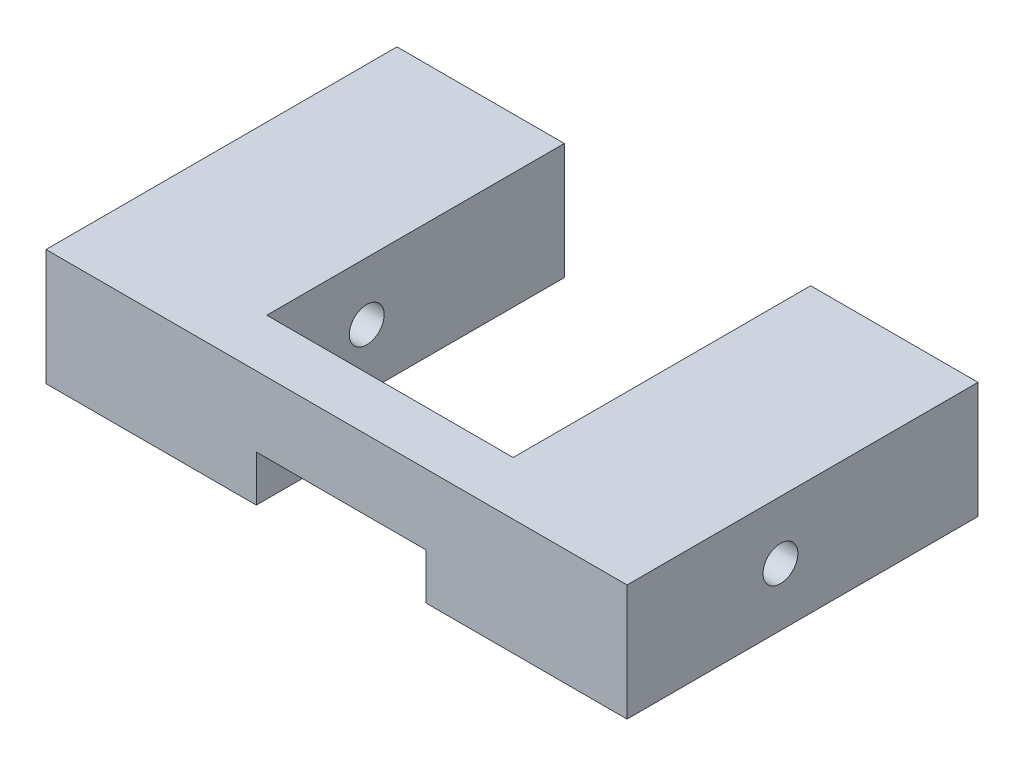
ISO-10303-21;
HEADER;
FILE_DESCRIPTION(('STEP AP214'),'2;1');
FILE_NAME('part.step','',(''),(''),'','','');
FILE_SCHEMA(('AUTOMOTIVE_DESIGN { 1 0 10303 214 1 1 1 1 }'));
ENDSEC;
DATA;
#1=APPLICATION_CONTEXT('core data for automotive mechanical design processes');
#2=APPLICATION_PROTOCOL_DEFINITION('international standard','automotive_design',2000,#1);
#3=PRODUCT_CONTEXT('',#1,'mechanical');
#4=PRODUCT('Part','Part','',(#3));
#5=PRODUCT_RELATED_PRODUCT_CATEGORY('part','',(#4));
#6=PRODUCT_DEFINITION_FORMATION('','',#4);
#7=PRODUCT_DEFINITION_CONTEXT('part definition',#1,'design');
#8=PRODUCT_DEFINITION('design','',#6,#7);
#9=PRODUCT_DEFINITION_SHAPE('','',#8);
#10=(LENGTH_UNIT() NAMED_UNIT(*) SI_UNIT(.MILLI.,.METRE.));
#11=(NAMED_UNIT(*) PLANE_ANGLE_UNIT() SI_UNIT($,.RADIAN.));
#12=(NAMED_UNIT(*) SI_UNIT($,.STERADIAN.) SOLID_ANGLE_UNIT());
#13=UNCERTAINTY_MEASURE_WITH_UNIT(LENGTH_MEASURE(1.E-05),#10,'distance_accuracy_value','');
#14=(GEOMETRIC_REPRESENTATION_CONTEXT(3) GLOBAL_UNCERTAINTY_ASSIGNED_CONTEXT((#13)) GLOBAL_UNIT_ASSIGNED_CONTEXT((#10,
#11,#12)) REPRESENTATION_CONTEXT('',''));
#15=CARTESIAN_POINT('',(0.,0.,0.));
#16=DIRECTION('',(0.,0.,1.));
#17=DIRECTION('',(1.,0.,0.));
#18=AXIS2_PLACEMENT_3D('',#15,#16,#17);
#19=CARTESIAN_POINT('',(0.,0.,0.));
#20=DIRECTION('',(0.,1.,0.));
#21=DIRECTION('',(0.,0.,1.));
#22=AXIS2_PLACEMENT_3D('',#19,#20,#21);
#23=PLANE('',#22);
#24=DIRECTION('',(1.,0.,0.));
#25=VECTOR('',#24,1.);
#26=CARTESIAN_POINT('',(-12.5,0.,4.8));
#27=LINE('',#26,#25);
#28=CARTESIAN_POINT('',(3.84999999999999,0.,4.8));
#29=VERTEX_POINT('',#28);
#30=CARTESIAN_POINT('',(12.5,0.,4.8));
#31=VERTEX_POINT('',#30);
#32=EDGE_CURVE('E241',#29,#31,#27,.T.);
#33=ORIENTED_EDGE('',*,*,#32,.F.);
#34=DIRECTION('',(0.,0.,-1.));
#35=VECTOR('',#34,1.);
#36=CARTESIAN_POINT('',(3.84999999999999,0.,12.5));
#37=LINE('',#36,#35);
#38=CARTESIAN_POINT('',(3.84999999999999,0.,2.5));
#39=VERTEX_POINT('',#38);
#40=EDGE_CURVE('E210',#29,#39,#37,.T.);
#41=ORIENTED_EDGE('',*,*,#40,.T.);
#42=DIRECTION('',(1.,0.,0.));
#43=VECTOR('',#42,1.);
#44=CARTESIAN_POINT('',(0.,0.,2.5));
#45=LINE('',#44,#43);
#46=CARTESIAN_POINT('',(5.3,0.,2.5));
#47=VERTEX_POINT('',#46);
#48=EDGE_CURVE('E70',#39,#47,#45,.T.);
#49=ORIENTED_EDGE('',*,*,#48,.T.);
#50=DIRECTION('',(0.,0.,-1.));
#51=VECTOR('',#50,1.);
#52=CARTESIAN_POINT('',(5.3,0.,0.));
#53=LINE('',#52,#51);
#54=CARTESIAN_POINT('',(5.3,0.,-10.3));
#55=VERTEX_POINT('',#54);
#56=EDGE_CURVE('E55',#47,#55,#53,.T.);
#57=ORIENTED_EDGE('',*,*,#56,.T.);
#58=DIRECTION('',(-1.,0.,0.));
#59=VECTOR('',#58,1.);
#60=CARTESIAN_POINT('',(12.5,0.,-10.3));
#61=LINE('',#60,#59);
#62=CARTESIAN_POINT('',(12.5,0.,-10.3));
#63=VERTEX_POINT('',#62);
#64=EDGE_CURVE('E172',#63,#55,#61,.T.);
#65=ORIENTED_EDGE('',*,*,#64,.F.);
#66=DIRECTION('',(0.,0.,-1.));
#67=VECTOR('',#66,1.);
#68=CARTESIAN_POINT('',(12.5,0.,4.8));
#69=LINE('',#68,#67);
#70=EDGE_CURVE('E260',#31,#63,#69,.T.);
#71=ORIENTED_EDGE('',*,*,#70,.F.);
#72=EDGE_LOOP('',(#33,#41,#49,#57,#65,#71));
#73=FACE_BOUND('',#72,.T.);
#74=ADVANCED_FACE('F45',(#73),#23,.F.);
#75=CARTESIAN_POINT('',(-12.5,5.,4.8));
#76=DIRECTION('',(0.,0.,-1.));
#77=DIRECTION('',(-1.,0.,0.));
#78=AXIS2_PLACEMENT_3D('',#75,#76,#77);
#79=PLANE('',#78);
#80=DIRECTION('',(1.,0.,0.));
#81=VECTOR('',#80,1.);
#82=CARTESIAN_POINT('',(-12.5,1.98,4.8));
#83=LINE('',#82,#81);
#84=CARTESIAN_POINT('',(-3.45,1.98,4.8));
#85=VERTEX_POINT('',#84);
#86=CARTESIAN_POINT('',(3.85,1.98,4.8));
#87=VERTEX_POINT('',#86);
#88=EDGE_CURVE('E225',#85,#87,#83,.T.);
#89=ORIENTED_EDGE('',*,*,#88,.T.);
#90=DIRECTION('',(0.,-1.,0.));
#91=VECTOR('',#90,1.);
#92=CARTESIAN_POINT('',(3.85,4.99999999999999,4.8));
#93=LINE('',#92,#91);
#94=EDGE_CURVE('E151',#87,#29,#93,.T.);
#95=ORIENTED_EDGE('',*,*,#94,.T.);
#96=ORIENTED_EDGE('',*,*,#32,.T.);
#97=DIRECTION('',(0.,-1.,0.));
#98=VECTOR('',#97,1.);
#99=CARTESIAN_POINT('',(12.5,5.,4.8));
#100=LINE('',#99,#98);
#101=CARTESIAN_POINT('',(12.5,5.,4.8));
#102=VERTEX_POINT('',#101);
#103=EDGE_CURVE('E267',#102,#31,#100,.T.);
#104=ORIENTED_EDGE('',*,*,#103,.F.);
#105=DIRECTION('',(1.,0.,0.));
#106=VECTOR('',#105,1.);
#107=CARTESIAN_POINT('',(-12.5,5.,4.8));
#108=LINE('',#107,#106);
#109=CARTESIAN_POINT('',(-12.5,5.,4.8));
#110=VERTEX_POINT('',#109);
#111=EDGE_CURVE('E244',#110,#102,#108,.T.);
#112=ORIENTED_EDGE('',*,*,#111,.F.);
#113=DIRECTION('',(0.,-1.,0.));
#114=VECTOR('',#113,1.);
#115=CARTESIAN_POINT('',(-12.5,5.,4.8));
#116=LINE('',#115,#114);
#117=CARTESIAN_POINT('',(-12.5,0.,4.8));
#118=VERTEX_POINT('',#117);
#119=EDGE_CURVE('E255',#110,#118,#116,.T.);
#120=ORIENTED_EDGE('',*,*,#119,.T.);
#121=CARTESIAN_POINT('',(-3.45000000000001,0.,4.8));
#122=VERTEX_POINT('',#121);
#123=EDGE_CURVE('E256',#118,#122,#27,.T.);
#124=ORIENTED_EDGE('',*,*,#123,.T.);
#125=DIRECTION('',(0.,1.,0.));
#126=VECTOR('',#125,1.);
#127=CARTESIAN_POINT('',(-3.45,5.,4.8));
#128=LINE('',#127,#126);
#129=EDGE_CURVE('E214',#122,#85,#128,.T.);
#130=ORIENTED_EDGE('',*,*,#129,.T.);
#131=EDGE_LOOP('',(#89,#95,#96,#104,#112,#120,#124,#130));
#132=FACE_BOUND('',#131,.T.);
#133=ADVANCED_FACE('F47',(#132),#79,.F.);
#134=CARTESIAN_POINT('',(12.5,5.,4.8));
#135=DIRECTION('',(-1.,0.,0.));
#136=DIRECTION('',(0.,0.,1.));
#137=AXIS2_PLACEMENT_3D('',#134,#135,#136);
#138=PLANE('',#137);
#139=CARTESIAN_POINT('',(12.5,2.5,-1.8));
#140=DIRECTION('',(-1.,0.,0.));
#141=DIRECTION('',(0.,0.,1.));
#142=AXIS2_PLACEMENT_3D('',#139,#140,#141);
#143=CIRCLE('',#142,0.75);
#144=CARTESIAN_POINT('',(12.5,2.5,-1.05));
#145=VERTEX_POINT('',#144);
#146=EDGE_CURVE('E196',#145,#145,#143,.T.);
#147=ORIENTED_EDGE('',*,*,#146,.T.);
#148=EDGE_LOOP('',(#147));
#149=FACE_BOUND('',#148,.T.);
#150=ORIENTED_EDGE('',*,*,#70,.T.);
#151=DIRECTION('',(0.,-1.,0.));
#152=VECTOR('',#151,1.);
#153=CARTESIAN_POINT('',(12.5,5.,-10.3));
#154=LINE('',#153,#152);
#155=CARTESIAN_POINT('',(12.5,5.,-10.3));
#156=VERTEX_POINT('',#155);
#157=EDGE_CURVE('E166',#156,#63,#154,.T.);
#158=ORIENTED_EDGE('',*,*,#157,.F.);
#159=DIRECTION('',(0.,0.,-1.));
#160=VECTOR('',#159,1.);
#161=CARTESIAN_POINT('',(12.5,5.,4.8));
#162=LINE('',#161,#160);
#163=EDGE_CURVE('E248',#102,#156,#162,.T.);
#164=ORIENTED_EDGE('',*,*,#163,.F.);
#165=ORIENTED_EDGE('',*,*,#103,.T.);
#166=EDGE_LOOP('',(#150,#158,#164,#165));
#167=FACE_BOUND('',#166,.T.);
#168=ADVANCED_FACE('F288',(#149,#167),#138,.F.);
#169=CARTESIAN_POINT('',(-12.5,5.,4.8));
#170=DIRECTION('',(-1.,0.,0.));
#171=DIRECTION('',(0.,0.,1.));
#172=AXIS2_PLACEMENT_3D('',#169,#170,#171);
#173=PLANE('',#172);
#174=CARTESIAN_POINT('',(-12.5,2.5,-1.8));
#175=DIRECTION('',(-1.,0.,0.));
#176=DIRECTION('',(0.,0.,1.));
#177=AXIS2_PLACEMENT_3D('',#174,#175,#176);
#178=CIRCLE('',#177,0.75);
#179=CARTESIAN_POINT('',(-12.5,2.5,-1.05));
#180=VERTEX_POINT('',#179);
#181=EDGE_CURVE('E188',#180,#180,#178,.T.);
#182=ORIENTED_EDGE('',*,*,#181,.F.);
#183=EDGE_LOOP('',(#182));
#184=FACE_BOUND('',#183,.T.);
#185=DIRECTION('',(0.,0.,-1.));
#186=VECTOR('',#185,1.);
#187=CARTESIAN_POINT('',(-12.5,0.,4.8));
#188=LINE('',#187,#186);
#189=CARTESIAN_POINT('',(-12.5,0.,-10.3));
#190=VERTEX_POINT('',#189);
#191=EDGE_CURVE('E249',#118,#190,#188,.T.);
#192=ORIENTED_EDGE('',*,*,#191,.F.);
#193=ORIENTED_EDGE('',*,*,#119,.F.);
#194=DIRECTION('',(0.,0.,-1.));
#195=VECTOR('',#194,1.);
#196=CARTESIAN_POINT('',(-12.5,5.,4.8));
#197=LINE('',#196,#195);
#198=CARTESIAN_POINT('',(-12.5,5.,-10.3));
#199=VERTEX_POINT('',#198);
#200=EDGE_CURVE('E252',#110,#199,#197,.T.);
#201=ORIENTED_EDGE('',*,*,#200,.T.);
#202=DIRECTION('',(0.,1.,0.));
#203=VECTOR('',#202,1.);
#204=CARTESIAN_POINT('',(-12.5,5.,-10.3));
#205=LINE('',#204,#203);
#206=EDGE_CURVE('E160',#190,#199,#205,.T.);
#207=ORIENTED_EDGE('',*,*,#206,.F.);
#208=EDGE_LOOP('',(#192,#193,#201,#207));
#209=FACE_BOUND('',#208,.T.);
#210=ADVANCED_FACE('F306',(#184,#209),#173,.T.);
#211=CARTESIAN_POINT('',(0.,5.,0.));
#212=DIRECTION('',(0.,1.,0.));
#213=DIRECTION('',(0.,0.,1.));
#214=AXIS2_PLACEMENT_3D('',#211,#212,#213);
#215=PLANE('',#214);
#216=DIRECTION('',(0.,0.,1.));
#217=VECTOR('',#216,1.);
#218=CARTESIAN_POINT('',(-5.3,5.,-4.8));
#219=LINE('',#218,#217);
#220=CARTESIAN_POINT('',(-5.3,5.,-10.3));
#221=VERTEX_POINT('',#220);
#222=CARTESIAN_POINT('',(-5.3,5.,2.5));
#223=VERTEX_POINT('',#222);
#224=EDGE_CURVE('E139',#221,#223,#219,.T.);
#225=ORIENTED_EDGE('',*,*,#224,.F.);
#226=DIRECTION('',(1.,0.,0.));
#227=VECTOR('',#226,1.);
#228=CARTESIAN_POINT('',(-5.3,5.,-10.3));
#229=LINE('',#228,#227);
#230=EDGE_CURVE('E143',#199,#221,#229,.T.);
#231=ORIENTED_EDGE('',*,*,#230,.F.);
#232=ORIENTED_EDGE('',*,*,#200,.F.);
#233=ORIENTED_EDGE('',*,*,#111,.T.);
#234=ORIENTED_EDGE('',*,*,#163,.T.);
#235=DIRECTION('',(1.,0.,0.));
#236=VECTOR('',#235,1.);
#237=CARTESIAN_POINT('',(12.5,5.,-10.3));
#238=LINE('',#237,#236);
#239=CARTESIAN_POINT('',(5.3,5.,-10.3));
#240=VERTEX_POINT('',#239);
#241=EDGE_CURVE('E184',#240,#156,#238,.T.);
#242=ORIENTED_EDGE('',*,*,#241,.F.);
#243=DIRECTION('',(0.,0.,-1.));
#244=VECTOR('',#243,1.);
#245=CARTESIAN_POINT('',(5.3,5.,-4.8));
#246=LINE('',#245,#244);
#247=CARTESIAN_POINT('',(5.3,5.,2.5));
#248=VERTEX_POINT('',#247);
#249=EDGE_CURVE('E234',#248,#240,#246,.T.);
#250=ORIENTED_EDGE('',*,*,#249,.F.);
#251=DIRECTION('',(1.,0.,0.));
#252=VECTOR('',#251,1.);
#253=CARTESIAN_POINT('',(-5.3,5.,2.5));
#254=LINE('',#253,#252);
#255=EDGE_CURVE('E146',#223,#248,#254,.T.);
#256=ORIENTED_EDGE('',*,*,#255,.F.);
#257=EDGE_LOOP('',(#225,#231,#232,#233,#234,#242,#250,#256));
#258=FACE_BOUND('',#257,.T.);
#259=ADVANCED_FACE('F141',(#258),#215,.T.);
#260=CARTESIAN_POINT('',(-5.3,0.,2.5));
#261=VERTEX_POINT('',#260);
#262=CARTESIAN_POINT('',(-3.45000000000001,0.,2.5));
#263=VERTEX_POINT('',#262);
#264=EDGE_CURVE('E271',#261,#263,#45,.T.);
#265=ORIENTED_EDGE('',*,*,#264,.T.);
#266=DIRECTION('',(0.,0.,-1.));
#267=VECTOR('',#266,1.);
#268=CARTESIAN_POINT('',(-3.45000000000001,0.,12.5));
#269=LINE('',#268,#267);
#270=EDGE_CURVE('E62',#122,#263,#269,.T.);
#271=ORIENTED_EDGE('',*,*,#270,.F.);
#272=ORIENTED_EDGE('',*,*,#123,.F.);
#273=ORIENTED_EDGE('',*,*,#191,.T.);
#274=DIRECTION('',(-1.,0.,0.));
#275=VECTOR('',#274,1.);
#276=CARTESIAN_POINT('',(-5.3,0.,-10.3));
#277=LINE('',#276,#275);
#278=CARTESIAN_POINT('',(-5.3,0.,-10.3));
#279=VERTEX_POINT('',#278);
#280=EDGE_CURVE('E167',#279,#190,#277,.T.);
#281=ORIENTED_EDGE('',*,*,#280,.F.);
#282=DIRECTION('',(0.,0.,1.));
#283=VECTOR('',#282,1.);
#284=CARTESIAN_POINT('',(-5.3,0.,0.));
#285=LINE('',#284,#283);
#286=EDGE_CURVE('E11',#279,#261,#285,.T.);
#287=ORIENTED_EDGE('',*,*,#286,.T.);
#288=EDGE_LOOP('',(#265,#271,#272,#273,#281,#287));
#289=FACE_BOUND('',#288,.T.);
#290=ADVANCED_FACE('F315',(#289),#23,.F.);
#291=CARTESIAN_POINT('',(-5.3,-5.,-4.8));
#292=DIRECTION('',(-1.,0.,0.));
#293=DIRECTION('',(0.,0.,1.));
#294=AXIS2_PLACEMENT_3D('',#291,#292,#293);
#295=PLANE('',#294);
#296=CARTESIAN_POINT('',(-5.3,2.5,-1.8));
#297=DIRECTION('',(-1.,0.,0.));
#298=DIRECTION('',(0.,0.,1.));
#299=AXIS2_PLACEMENT_3D('',#296,#297,#298);
#300=CIRCLE('',#299,0.75);
#301=CARTESIAN_POINT('',(-5.3,2.5,-1.05));
#302=VERTEX_POINT('',#301);
#303=EDGE_CURVE('E192',#302,#302,#300,.T.);
#304=ORIENTED_EDGE('',*,*,#303,.T.);
#305=EDGE_LOOP('',(#304));
#306=FACE_BOUND('',#305,.T.);
#307=ORIENTED_EDGE('',*,*,#286,.F.);
#308=DIRECTION('',(0.,-1.,0.));
#309=VECTOR('',#308,1.);
#310=CARTESIAN_POINT('',(-5.3,5.,-10.3));
#311=LINE('',#310,#309);
#312=EDGE_CURVE('E158',#221,#279,#311,.T.);
#313=ORIENTED_EDGE('',*,*,#312,.F.);
#314=ORIENTED_EDGE('',*,*,#224,.T.);
#315=DIRECTION('',(0.,1.,0.));
#316=VECTOR('',#315,1.);
#317=CARTESIAN_POINT('',(-5.3,-5.,2.5));
#318=LINE('',#317,#316);
#319=EDGE_CURVE('E237',#261,#223,#318,.T.);
#320=ORIENTED_EDGE('',*,*,#319,.F.);
#321=EDGE_LOOP('',(#307,#313,#314,#320));
#322=FACE_BOUND('',#321,.T.);
#323=ADVANCED_FACE('F163',(#306,#322),#295,.F.);
#324=CARTESIAN_POINT('',(5.3,-5.,-4.8));
#325=DIRECTION('',(1.,0.,0.));
#326=DIRECTION('',(0.,0.,-1.));
#327=AXIS2_PLACEMENT_3D('',#324,#325,#326);
#328=PLANE('',#327);
#329=CARTESIAN_POINT('',(5.3,2.5,-1.8));
#330=DIRECTION('',(1.,0.,0.));
#331=DIRECTION('',(0.,0.,-1.));
#332=AXIS2_PLACEMENT_3D('',#329,#330,#331);
#333=CIRCLE('',#332,0.75);
#334=CARTESIAN_POINT('',(5.3,2.5,-2.55));
#335=VERTEX_POINT('',#334);
#336=EDGE_CURVE('E49',#335,#335,#333,.T.);
#337=ORIENTED_EDGE('',*,*,#336,.T.);
#338=EDGE_LOOP('',(#337));
#339=FACE_BOUND('',#338,.T.);
#340=DIRECTION('',(0.,1.,0.));
#341=VECTOR('',#340,1.);
#342=CARTESIAN_POINT('',(5.3,-5.,2.5));
#343=LINE('',#342,#341);
#344=EDGE_CURVE('E238',#47,#248,#343,.T.);
#345=ORIENTED_EDGE('',*,*,#344,.T.);
#346=ORIENTED_EDGE('',*,*,#249,.T.);
#347=DIRECTION('',(0.,1.,0.));
#348=VECTOR('',#347,1.);
#349=CARTESIAN_POINT('',(5.3,5.,-10.3));
#350=LINE('',#349,#348);
#351=EDGE_CURVE('E180',#55,#240,#350,.T.);
#352=ORIENTED_EDGE('',*,*,#351,.F.);
#353=ORIENTED_EDGE('',*,*,#56,.F.);
#354=EDGE_LOOP('',(#345,#346,#352,#353));
#355=FACE_BOUND('',#354,.T.);
#356=ADVANCED_FACE('F286',(#339,#355),#328,.F.);
#357=CARTESIAN_POINT('',(-5.3,-5.,2.5));
#358=DIRECTION('',(0.,0.,1.));
#359=DIRECTION('',(1.,0.,0.));
#360=AXIS2_PLACEMENT_3D('',#357,#358,#359);
#361=PLANE('',#360);
#362=ORIENTED_EDGE('',*,*,#48,.F.);
#363=DIRECTION('',(0.,-1.,0.));
#364=VECTOR('',#363,1.);
#365=CARTESIAN_POINT('',(3.84999999999999,0.,2.5));
#366=LINE('',#365,#364);
#367=CARTESIAN_POINT('',(3.85,1.98,2.5));
#368=VERTEX_POINT('',#367);
#369=EDGE_CURVE('E200',#368,#39,#366,.T.);
#370=ORIENTED_EDGE('',*,*,#369,.F.);
#371=DIRECTION('',(1.,0.,0.));
#372=VECTOR('',#371,1.);
#373=CARTESIAN_POINT('',(3.85,1.98,2.5));
#374=LINE('',#373,#372);
#375=CARTESIAN_POINT('',(-3.45,1.98,2.5));
#376=VERTEX_POINT('',#375);
#377=EDGE_CURVE('E206',#376,#368,#374,.T.);
#378=ORIENTED_EDGE('',*,*,#377,.F.);
#379=DIRECTION('',(0.,1.,0.));
#380=VECTOR('',#379,1.);
#381=CARTESIAN_POINT('',(-3.45000000000001,0.,2.5));
#382=LINE('',#381,#380);
#383=EDGE_CURVE('E203',#263,#376,#382,.T.);
#384=ORIENTED_EDGE('',*,*,#383,.F.);
#385=ORIENTED_EDGE('',*,*,#264,.F.);
#386=ORIENTED_EDGE('',*,*,#319,.T.);
#387=ORIENTED_EDGE('',*,*,#255,.T.);
#388=ORIENTED_EDGE('',*,*,#344,.F.);
#389=EDGE_LOOP('',(#362,#370,#378,#384,#385,#386,#387,#388));
#390=FACE_BOUND('',#389,.T.);
#391=ADVANCED_FACE('F330',(#390),#361,.F.);
#392=CARTESIAN_POINT('',(3.84999999999999,0.,12.5));
#393=DIRECTION('',(1.,0.,0.));
#394=DIRECTION('',(0.,1.,0.));
#395=AXIS2_PLACEMENT_3D('',#392,#393,#394);
#396=PLANE('',#395);
#397=DIRECTION('',(0.,0.,-1.));
#398=VECTOR('',#397,1.);
#399=CARTESIAN_POINT('',(3.85,1.98,12.5));
#400=LINE('',#399,#398);
#401=EDGE_CURVE('E211',#87,#368,#400,.T.);
#402=ORIENTED_EDGE('',*,*,#401,.T.);
#403=ORIENTED_EDGE('',*,*,#369,.T.);
#404=ORIENTED_EDGE('',*,*,#40,.F.);
#405=ORIENTED_EDGE('',*,*,#94,.F.);
#406=EDGE_LOOP('',(#402,#403,#404,#405));
#407=FACE_BOUND('',#406,.T.);
#408=ADVANCED_FACE('F342',(#407),#396,.F.);
#409=CARTESIAN_POINT('',(3.85,1.98,12.5));
#410=DIRECTION('',(0.,1.,0.));
#411=DIRECTION('',(-1.,0.,0.));
#412=AXIS2_PLACEMENT_3D('',#409,#410,#411);
#413=PLANE('',#412);
#414=DIRECTION('',(0.,0.,-1.));
#415=VECTOR('',#414,1.);
#416=CARTESIAN_POINT('',(-3.45,1.98,12.5));
#417=LINE('',#416,#415);
#418=EDGE_CURVE('E215',#85,#376,#417,.T.);
#419=ORIENTED_EDGE('',*,*,#418,.T.);
#420=ORIENTED_EDGE('',*,*,#377,.T.);
#421=ORIENTED_EDGE('',*,*,#401,.F.);
#422=ORIENTED_EDGE('',*,*,#88,.F.);
#423=EDGE_LOOP('',(#419,#420,#421,#422));
#424=FACE_BOUND('',#423,.T.);
#425=ADVANCED_FACE('F340',(#424),#413,.F.);
#426=CARTESIAN_POINT('',(-3.45000000000001,0.,12.5));
#427=DIRECTION('',(-1.,0.,0.));
#428=DIRECTION('',(0.,-1.,0.));
#429=AXIS2_PLACEMENT_3D('',#426,#427,#428);
#430=PLANE('',#429);
#431=ORIENTED_EDGE('',*,*,#270,.T.);
#432=ORIENTED_EDGE('',*,*,#383,.T.);
#433=ORIENTED_EDGE('',*,*,#418,.F.);
#434=ORIENTED_EDGE('',*,*,#129,.F.);
#435=EDGE_LOOP('',(#431,#432,#433,#434));
#436=FACE_BOUND('',#435,.T.);
#437=ADVANCED_FACE('F301',(#436),#430,.F.);
#438=CARTESIAN_POINT('',(13.5,2.5,-1.8));
#439=DIRECTION('',(-1.,0.,0.));
#440=DIRECTION('',(0.,0.,1.));
#441=AXIS2_PLACEMENT_3D('',#438,#439,#440);
#442=CYLINDRICAL_SURFACE('',#441,0.75);
#443=ORIENTED_EDGE('',*,*,#336,.F.);
#444=EDGE_LOOP('',(#443));
#445=FACE_BOUND('',#444,.T.);
#446=ORIENTED_EDGE('',*,*,#146,.F.);
#447=EDGE_LOOP('',(#446));
#448=FACE_BOUND('',#447,.T.);
#449=ADVANCED_FACE('F297',(#445,#448),#442,.F.);
#450=ORIENTED_EDGE('',*,*,#181,.T.);
#451=EDGE_LOOP('',(#450));
#452=FACE_BOUND('',#451,.T.);
#453=ORIENTED_EDGE('',*,*,#303,.F.);
#454=EDGE_LOOP('',(#453));
#455=FACE_BOUND('',#454,.T.);
#456=ADVANCED_FACE('F300',(#452,#455),#442,.F.);
#457=CARTESIAN_POINT('',(0.,0.,-10.3));
#458=DIRECTION('',(0.,0.,-1.));
#459=DIRECTION('',(-1.,0.,0.));
#460=AXIS2_PLACEMENT_3D('',#457,#458,#459);
#461=PLANE('',#460);
#462=ORIENTED_EDGE('',*,*,#157,.T.);
#463=ORIENTED_EDGE('',*,*,#64,.T.);
#464=ORIENTED_EDGE('',*,*,#351,.T.);
#465=ORIENTED_EDGE('',*,*,#241,.T.);
#466=EDGE_LOOP('',(#462,#463,#464,#465));
#467=FACE_BOUND('',#466,.T.);
#468=ADVANCED_FACE('F283',(#467),#461,.T.);
#469=CARTESIAN_POINT('',(0.,0.,-10.3));
#470=DIRECTION('',(0.,0.,-1.));
#471=DIRECTION('',(-1.,0.,0.));
#472=AXIS2_PLACEMENT_3D('',#469,#470,#471);
#473=PLANE('',#472);
#474=ORIENTED_EDGE('',*,*,#312,.T.);
#475=ORIENTED_EDGE('',*,*,#280,.T.);
#476=ORIENTED_EDGE('',*,*,#206,.T.);
#477=ORIENTED_EDGE('',*,*,#230,.T.);
#478=EDGE_LOOP('',(#474,#475,#476,#477));
#479=FACE_BOUND('',#478,.T.);
#480=ADVANCED_FACE('F156',(#479),#473,.T.);
#481=CLOSED_SHELL('',(#74,#133,#168,#210,#259,#290,#323,#356,#391,#408,#425,#437,#449,#456,#468,#480));
#482=MANIFOLD_SOLID_BREP('B2',#481);
#483=ADVANCED_BREP_SHAPE_REPRESENTATION('',(#18,#482),#14);
#484=SHAPE_DEFINITION_REPRESENTATION(#9,#483);
ENDSEC;
END-ISO-10303-21;
